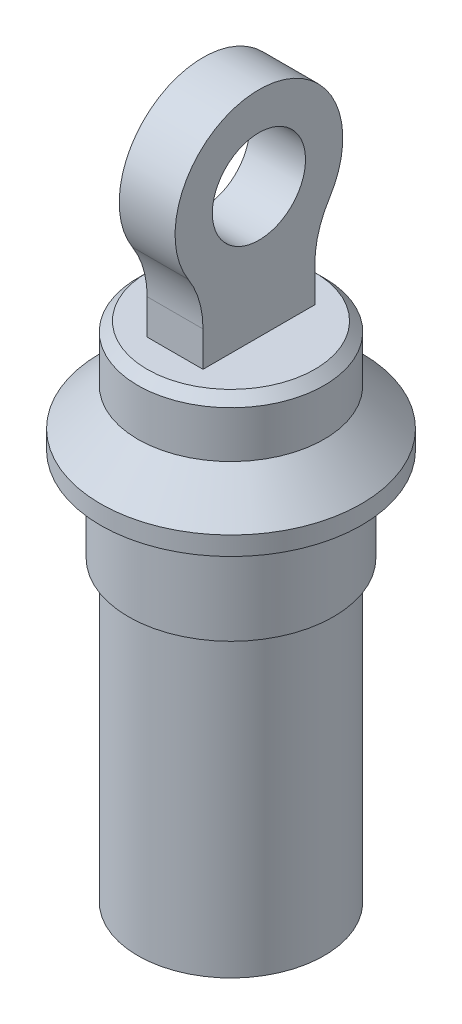
ISO-10303-21;
HEADER;
FILE_DESCRIPTION(('STEP AP214'),'2;1');
FILE_NAME('part.step','',(''),(''),'','','');
FILE_SCHEMA(('AUTOMOTIVE_DESIGN { 1 0 10303 214 1 1 1 1 }'));
ENDSEC;
DATA;
#1=APPLICATION_CONTEXT('core data for automotive mechanical design processes');
#2=APPLICATION_PROTOCOL_DEFINITION('international standard','automotive_design',2000,#1);
#3=PRODUCT_CONTEXT('',#1,'mechanical');
#4=PRODUCT('Part','Part','',(#3));
#5=PRODUCT_RELATED_PRODUCT_CATEGORY('part','',(#4));
#6=PRODUCT_DEFINITION_FORMATION('','',#4);
#7=PRODUCT_DEFINITION_CONTEXT('part definition',#1,'design');
#8=PRODUCT_DEFINITION('design','',#6,#7);
#9=PRODUCT_DEFINITION_SHAPE('','',#8);
#10=(LENGTH_UNIT() NAMED_UNIT(*) SI_UNIT(.MILLI.,.METRE.));
#11=(NAMED_UNIT(*) PLANE_ANGLE_UNIT() SI_UNIT($,.RADIAN.));
#12=(NAMED_UNIT(*) SI_UNIT($,.STERADIAN.) SOLID_ANGLE_UNIT());
#13=UNCERTAINTY_MEASURE_WITH_UNIT(LENGTH_MEASURE(1.E-05),#10,'distance_accuracy_value','');
#14=(GEOMETRIC_REPRESENTATION_CONTEXT(3) GLOBAL_UNCERTAINTY_ASSIGNED_CONTEXT((#13)) GLOBAL_UNIT_ASSIGNED_CONTEXT((#10,
#11,#12)) REPRESENTATION_CONTEXT('',''));
#15=CARTESIAN_POINT('',(0.,0.,0.));
#16=DIRECTION('',(0.,0.,1.));
#17=DIRECTION('',(1.,0.,0.));
#18=AXIS2_PLACEMENT_3D('',#15,#16,#17);
#19=CARTESIAN_POINT('',(0.,8.,0.));
#20=DIRECTION('',(0.,-1.,0.));
#21=DIRECTION('',(0.,0.,-1.));
#22=AXIS2_PLACEMENT_3D('',#19,#20,#21);
#23=CYLINDRICAL_SURFACE('',#22,5.);
#24=CARTESIAN_POINT('',(0.,8.,0.));
#25=DIRECTION('',(0.,1.,0.));
#26=DIRECTION('',(0.,0.,1.));
#27=AXIS2_PLACEMENT_3D('',#24,#25,#26);
#28=CIRCLE('',#27,5.);
#29=CARTESIAN_POINT('',(0.,8.,5.));
#30=VERTEX_POINT('',#29);
#31=EDGE_CURVE('E137',#30,#30,#28,.T.);
#32=ORIENTED_EDGE('',*,*,#31,.F.);
#33=EDGE_LOOP('',(#32));
#34=FACE_BOUND('',#33,.T.);
#35=CARTESIAN_POINT('',(0.,-8.,0.));
#36=DIRECTION('',(0.,-1.,0.));
#37=DIRECTION('',(0.,0.,-1.));
#38=AXIS2_PLACEMENT_3D('',#35,#36,#37);
#39=CIRCLE('',#38,5.);
#40=CARTESIAN_POINT('',(0.,-8.,-5.));
#41=VERTEX_POINT('',#40);
#42=EDGE_CURVE('E387',#41,#41,#39,.T.);
#43=ORIENTED_EDGE('',*,*,#42,.F.);
#44=EDGE_LOOP('',(#43));
#45=FACE_BOUND('',#44,.T.);
#46=ADVANCED_FACE('F40',(#34,#45),#23,.T.);
#47=CARTESIAN_POINT('',(0.,13.,0.));
#48=DIRECTION('',(0.,-1.,0.));
#49=DIRECTION('',(0.,0.,-1.));
#50=AXIS2_PLACEMENT_3D('',#47,#48,#49);
#51=CYLINDRICAL_SURFACE('',#50,5.5);
#52=CARTESIAN_POINT('',(0.,13.,0.));
#53=DIRECTION('',(0.,1.,0.));
#54=DIRECTION('',(0.,0.,1.));
#55=AXIS2_PLACEMENT_3D('',#52,#53,#54);
#56=CIRCLE('',#55,5.5);
#57=CARTESIAN_POINT('',(0.,13.,5.5));
#58=VERTEX_POINT('',#57);
#59=EDGE_CURVE('E134',#58,#58,#56,.T.);
#60=ORIENTED_EDGE('',*,*,#59,.F.);
#61=EDGE_LOOP('',(#60));
#62=FACE_BOUND('',#61,.T.);
#63=CARTESIAN_POINT('',(0.,8.,0.));
#64=DIRECTION('',(0.,1.,0.));
#65=DIRECTION('',(0.,0.,1.));
#66=AXIS2_PLACEMENT_3D('',#63,#64,#65);
#67=CIRCLE('',#66,5.5);
#68=CARTESIAN_POINT('',(0.,8.,5.5));
#69=VERTEX_POINT('',#68);
#70=EDGE_CURVE('E131',#69,#69,#67,.T.);
#71=ORIENTED_EDGE('',*,*,#70,.T.);
#72=EDGE_LOOP('',(#71));
#73=FACE_BOUND('',#72,.T.);
#74=ADVANCED_FACE('F178',(#62,#73),#51,.T.);
#75=CARTESIAN_POINT('',(0.,8.,0.));
#76=DIRECTION('',(0.,1.,0.));
#77=DIRECTION('',(0.,0.,1.));
#78=AXIS2_PLACEMENT_3D('',#75,#76,#77);
#79=PLANE('',#78);
#80=ORIENTED_EDGE('',*,*,#31,.T.);
#81=EDGE_LOOP('',(#80));
#82=FACE_BOUND('',#81,.T.);
#83=ORIENTED_EDGE('',*,*,#70,.F.);
#84=EDGE_LOOP('',(#83));
#85=FACE_BOUND('',#84,.T.);
#86=ADVANCED_FACE('F184',(#82,#85),#79,.F.);
#87=CARTESIAN_POINT('',(0.,14.,0.));
#88=DIRECTION('',(0.,-1.,0.));
#89=DIRECTION('',(0.,0.,-1.));
#90=AXIS2_PLACEMENT_3D('',#87,#88,#89);
#91=CYLINDRICAL_SURFACE('',#90,7.);
#92=CARTESIAN_POINT('',(0.,14.,0.));
#93=DIRECTION('',(0.,1.,0.));
#94=DIRECTION('',(0.,0.,1.));
#95=AXIS2_PLACEMENT_3D('',#92,#93,#94);
#96=CIRCLE('',#95,7.);
#97=CARTESIAN_POINT('',(0.,14.,7.));
#98=VERTEX_POINT('',#97);
#99=EDGE_CURVE('E128',#98,#98,#96,.T.);
#100=ORIENTED_EDGE('',*,*,#99,.F.);
#101=EDGE_LOOP('',(#100));
#102=FACE_BOUND('',#101,.T.);
#103=CARTESIAN_POINT('',(0.,13.,0.));
#104=DIRECTION('',(0.,1.,0.));
#105=DIRECTION('',(0.,0.,1.));
#106=AXIS2_PLACEMENT_3D('',#103,#104,#105);
#107=CIRCLE('',#106,7.);
#108=CARTESIAN_POINT('',(0.,13.,7.));
#109=VERTEX_POINT('',#108);
#110=EDGE_CURVE('E127',#109,#109,#107,.T.);
#111=ORIENTED_EDGE('',*,*,#110,.T.);
#112=EDGE_LOOP('',(#111));
#113=FACE_BOUND('',#112,.T.);
#114=ADVANCED_FACE('F215',(#102,#113),#91,.T.);
#115=CARTESIAN_POINT('',(0.,13.,0.));
#116=DIRECTION('',(0.,1.,0.));
#117=DIRECTION('',(0.,0.,1.));
#118=AXIS2_PLACEMENT_3D('',#115,#116,#117);
#119=PLANE('',#118);
#120=ORIENTED_EDGE('',*,*,#59,.T.);
#121=EDGE_LOOP('',(#120));
#122=FACE_BOUND('',#121,.T.);
#123=ORIENTED_EDGE('',*,*,#110,.F.);
#124=EDGE_LOOP('',(#123));
#125=FACE_BOUND('',#124,.T.);
#126=ADVANCED_FACE('F218',(#122,#125),#119,.F.);
#127=CARTESIAN_POINT('',(0.,19.,0.));
#128=DIRECTION('',(0.,1.,0.));
#129=DIRECTION('',(0.,0.,1.));
#130=AXIS2_PLACEMENT_3D('',#127,#128,#129);
#131=PLANE('',#130);
#132=DIRECTION('',(0.,0.,-1.));
#133=VECTOR('',#132,1.);
#134=CARTESIAN_POINT('',(1.49816734392516,19.,3.));
#135=LINE('',#134,#133);
#136=CARTESIAN_POINT('',(1.49816734392516,19.,3.));
#137=VERTEX_POINT('',#136);
#138=CARTESIAN_POINT('',(1.49816734392516,19.,-3.));
#139=VERTEX_POINT('',#138);
#140=EDGE_CURVE('E113',#137,#139,#135,.T.);
#141=ORIENTED_EDGE('',*,*,#140,.F.);
#142=DIRECTION('',(1.,0.,0.));
#143=VECTOR('',#142,1.);
#144=CARTESIAN_POINT('',(-1.49816734392516,19.,3.));
#145=LINE('',#144,#143);
#146=CARTESIAN_POINT('',(-1.49816734392516,19.,3.));
#147=VERTEX_POINT('',#146);
#148=EDGE_CURVE('E109',#147,#137,#145,.T.);
#149=ORIENTED_EDGE('',*,*,#148,.F.);
#150=DIRECTION('',(0.,0.,1.));
#151=VECTOR('',#150,1.);
#152=CARTESIAN_POINT('',(-1.49816734392516,19.,3.));
#153=LINE('',#152,#151);
#154=CARTESIAN_POINT('',(-1.49816734392516,19.,-3.));
#155=VERTEX_POINT('',#154);
#156=EDGE_CURVE('E94',#155,#147,#153,.T.);
#157=ORIENTED_EDGE('',*,*,#156,.F.);
#158=DIRECTION('',(-1.,0.,0.));
#159=VECTOR('',#158,1.);
#160=CARTESIAN_POINT('',(-1.49816734392516,19.,-3.));
#161=LINE('',#160,#159);
#162=EDGE_CURVE('E106',#139,#155,#161,.T.);
#163=ORIENTED_EDGE('',*,*,#162,.F.);
#164=EDGE_LOOP('',(#141,#149,#157,#163));
#165=FACE_BOUND('',#164,.T.);
#166=CARTESIAN_POINT('',(0.,19.,0.));
#167=DIRECTION('',(0.,1.,0.));
#168=DIRECTION('',(0.,0.,1.));
#169=AXIS2_PLACEMENT_3D('',#166,#167,#168);
#170=CIRCLE('',#169,4.49999999999999);
#171=CARTESIAN_POINT('',(0.,19.,4.49999999999999));
#172=VERTEX_POINT('',#171);
#173=EDGE_CURVE('E145',#172,#172,#170,.T.);
#174=ORIENTED_EDGE('',*,*,#173,.T.);
#175=EDGE_LOOP('',(#174));
#176=FACE_BOUND('',#175,.T.);
#177=ADVANCED_FACE('F104',(#165,#176),#131,.T.);
#178=CARTESIAN_POINT('',(0.,14.,0.));
#179=DIRECTION('',(0.,-1.,0.));
#180=DIRECTION('',(0.,0.,-1.));
#181=AXIS2_PLACEMENT_3D('',#178,#179,#180);
#182=CYLINDRICAL_SURFACE('',#181,5.);
#183=CARTESIAN_POINT('',(0.,18.5,0.));
#184=DIRECTION('',(0.,1.,0.));
#185=DIRECTION('',(0.,0.,1.));
#186=AXIS2_PLACEMENT_3D('',#183,#184,#185);
#187=CIRCLE('',#186,5.);
#188=CARTESIAN_POINT('',(0.,18.5,5.));
#189=VERTEX_POINT('',#188);
#190=EDGE_CURVE('E142',#189,#189,#187,.F.);
#191=ORIENTED_EDGE('',*,*,#190,.T.);
#192=EDGE_LOOP('',(#191));
#193=FACE_BOUND('',#192,.T.);
#194=CARTESIAN_POINT('',(0.,16.,0.));
#195=DIRECTION('',(0.,-1.,0.));
#196=DIRECTION('',(0.,0.,-1.));
#197=AXIS2_PLACEMENT_3D('',#194,#195,#196);
#198=CIRCLE('',#197,5.);
#199=CARTESIAN_POINT('',(0.,16.,-5.));
#200=VERTEX_POINT('',#199);
#201=EDGE_CURVE('E124',#200,#200,#198,.T.);
#202=ORIENTED_EDGE('',*,*,#201,.F.);
#203=EDGE_LOOP('',(#202));
#204=FACE_BOUND('',#203,.T.);
#205=ADVANCED_FACE('F201',(#193,#204),#182,.T.);
#206=CARTESIAN_POINT('',(0.,14.,0.));
#207=DIRECTION('',(0.,-1.,0.));
#208=DIRECTION('',(0.,0.,-1.));
#209=AXIS2_PLACEMENT_3D('',#206,#207,#208);
#210=CONICAL_SURFACE('',#209,7.,0.785398163397447);
#211=ORIENTED_EDGE('',*,*,#201,.T.);
#212=EDGE_LOOP('',(#211));
#213=FACE_BOUND('',#212,.T.);
#214=ORIENTED_EDGE('',*,*,#99,.T.);
#215=EDGE_LOOP('',(#214));
#216=FACE_BOUND('',#215,.T.);
#217=ADVANCED_FACE('F193',(#213,#216),#210,.T.);
#218=CARTESIAN_POINT('',(0.,18.5,0.));
#219=DIRECTION('',(0.,-1.,0.));
#220=DIRECTION('',(0.,0.,-1.));
#221=AXIS2_PLACEMENT_3D('',#218,#219,#220);
#222=CONICAL_SURFACE('',#221,5.,0.785398163397454);
#223=ORIENTED_EDGE('',*,*,#173,.F.);
#224=EDGE_LOOP('',(#223));
#225=FACE_BOUND('',#224,.T.);
#226=ORIENTED_EDGE('',*,*,#190,.F.);
#227=EDGE_LOOP('',(#226));
#228=FACE_BOUND('',#227,.T.);
#229=ADVANCED_FACE('F191',(#225,#228),#222,.T.);
#230=CARTESIAN_POINT('',(1.49816734392516,26.,3.));
#231=DIRECTION('',(-1.,0.,0.));
#232=DIRECTION('',(0.,0.,1.));
#233=AXIS2_PLACEMENT_3D('',#230,#231,#232);
#234=PLANE('',#233);
#235=CARTESIAN_POINT('',(1.49816734392516,26.,0.));
#236=DIRECTION('',(-1.,0.,0.));
#237=DIRECTION('',(0.,0.,1.));
#238=AXIS2_PLACEMENT_3D('',#235,#236,#237);
#239=CIRCLE('',#238,2.5);
#240=CARTESIAN_POINT('',(1.49816734392516,26.,2.5));
#241=VERTEX_POINT('',#240);
#242=EDGE_CURVE('E379',#241,#241,#239,.T.);
#243=ORIENTED_EDGE('',*,*,#242,.T.);
#244=EDGE_LOOP('',(#243));
#245=FACE_BOUND('',#244,.T.);
#246=DIRECTION('',(0.,-1.,0.));
#247=VECTOR('',#246,1.);
#248=CARTESIAN_POINT('',(1.49816734392516,26.,-3.));
#249=LINE('',#248,#247);
#250=CARTESIAN_POINT('',(1.49816734392516,20.8765246170202,-3.));
#251=VERTEX_POINT('',#250);
#252=EDGE_CURVE('E97',#251,#139,#249,.T.);
#253=ORIENTED_EDGE('',*,*,#252,.F.);
#254=CARTESIAN_POINT('',(1.49816734392516,20.8765246170202,-8.));
#255=DIRECTION('',(-1.,0.,0.));
#256=DIRECTION('',(0.,0.,1.));
#257=AXIS2_PLACEMENT_3D('',#254,#255,#256);
#258=CIRCLE('',#257,5.);
#259=CARTESIAN_POINT('',(1.49816734392516,23.5730906080622,-3.78947368421053));
#260=VERTEX_POINT('',#259);
#261=EDGE_CURVE('E48',#251,#260,#258,.T.);
#262=ORIENTED_EDGE('',*,*,#261,.T.);
#263=CARTESIAN_POINT('',(1.49816734392516,26.,0.));
#264=DIRECTION('',(1.,0.,0.));
#265=DIRECTION('',(0.,0.,-1.));
#266=AXIS2_PLACEMENT_3D('',#263,#264,#265);
#267=CIRCLE('',#266,4.5);
#268=CARTESIAN_POINT('',(1.49816734392516,23.5730906080622,3.78947368421053));
#269=VERTEX_POINT('',#268);
#270=EDGE_CURVE('E115',#260,#269,#267,.T.);
#271=ORIENTED_EDGE('',*,*,#270,.T.);
#272=CARTESIAN_POINT('',(1.49816734392516,20.8765246170202,8.));
#273=DIRECTION('',(-1.,0.,0.));
#274=DIRECTION('',(0.,0.,1.));
#275=AXIS2_PLACEMENT_3D('',#272,#273,#274);
#276=CIRCLE('',#275,5.);
#277=CARTESIAN_POINT('',(1.49816734392516,20.8765246170202,3.));
#278=VERTEX_POINT('',#277);
#279=EDGE_CURVE('E159',#269,#278,#276,.T.);
#280=ORIENTED_EDGE('',*,*,#279,.T.);
#281=DIRECTION('',(0.,-1.,0.));
#282=VECTOR('',#281,1.);
#283=CARTESIAN_POINT('',(1.49816734392516,26.,3.));
#284=LINE('',#283,#282);
#285=EDGE_CURVE('E120',#278,#137,#284,.T.);
#286=ORIENTED_EDGE('',*,*,#285,.T.);
#287=ORIENTED_EDGE('',*,*,#140,.T.);
#288=EDGE_LOOP('',(#253,#262,#271,#280,#286,#287));
#289=FACE_BOUND('',#288,.T.);
#290=ADVANCED_FACE('F163',(#245,#289),#234,.F.);
#291=CARTESIAN_POINT('',(-1.49816734392516,26.,-3.));
#292=DIRECTION('',(0.,0.,1.));
#293=DIRECTION('',(1.,0.,0.));
#294=AXIS2_PLACEMENT_3D('',#291,#292,#293);
#295=PLANE('',#294);
#296=DIRECTION('',(0.,-1.,0.));
#297=VECTOR('',#296,1.);
#298=CARTESIAN_POINT('',(-1.49816734392516,26.,-3.));
#299=LINE('',#298,#297);
#300=CARTESIAN_POINT('',(-1.49816734392516,20.8765246170202,-3.));
#301=VERTEX_POINT('',#300);
#302=EDGE_CURVE('E90',#301,#155,#299,.T.);
#303=ORIENTED_EDGE('',*,*,#302,.F.);
#304=DIRECTION('',(1.,0.,0.));
#305=VECTOR('',#304,1.);
#306=CARTESIAN_POINT('',(-1.49816734392516,20.8765246170202,-3.));
#307=LINE('',#306,#305);
#308=EDGE_CURVE('E155',#301,#251,#307,.T.);
#309=ORIENTED_EDGE('',*,*,#308,.T.);
#310=ORIENTED_EDGE('',*,*,#252,.T.);
#311=ORIENTED_EDGE('',*,*,#162,.T.);
#312=EDGE_LOOP('',(#303,#309,#310,#311));
#313=FACE_BOUND('',#312,.T.);
#314=ADVANCED_FACE('F111',(#313),#295,.F.);
#315=CARTESIAN_POINT('',(-1.49816734392516,26.,3.));
#316=DIRECTION('',(1.,0.,0.));
#317=DIRECTION('',(0.,0.,-1.));
#318=AXIS2_PLACEMENT_3D('',#315,#316,#317);
#319=PLANE('',#318);
#320=CARTESIAN_POINT('',(-1.49816734392516,26.,0.));
#321=DIRECTION('',(-1.,0.,0.));
#322=DIRECTION('',(0.,0.,1.));
#323=AXIS2_PLACEMENT_3D('',#320,#321,#322);
#324=CIRCLE('',#323,2.5);
#325=CARTESIAN_POINT('',(-1.49816734392516,26.,2.5));
#326=VERTEX_POINT('',#325);
#327=EDGE_CURVE('E382',#326,#326,#324,.T.);
#328=ORIENTED_EDGE('',*,*,#327,.F.);
#329=EDGE_LOOP('',(#328));
#330=FACE_BOUND('',#329,.T.);
#331=DIRECTION('',(0.,-1.,0.));
#332=VECTOR('',#331,1.);
#333=CARTESIAN_POINT('',(-1.49816734392516,26.,3.));
#334=LINE('',#333,#332);
#335=CARTESIAN_POINT('',(-1.49816734392516,20.8765246170202,3.));
#336=VERTEX_POINT('',#335);
#337=EDGE_CURVE('E98',#336,#147,#334,.T.);
#338=ORIENTED_EDGE('',*,*,#337,.F.);
#339=CARTESIAN_POINT('',(-1.49816734392516,20.8765246170202,8.));
#340=DIRECTION('',(1.,0.,0.));
#341=DIRECTION('',(0.,0.,-1.));
#342=AXIS2_PLACEMENT_3D('',#339,#340,#341);
#343=CIRCLE('',#342,5.);
#344=CARTESIAN_POINT('',(-1.49816734392516,23.5730906080622,3.78947368421052));
#345=VERTEX_POINT('',#344);
#346=EDGE_CURVE('E157',#336,#345,#343,.T.);
#347=ORIENTED_EDGE('',*,*,#346,.T.);
#348=CARTESIAN_POINT('',(-1.49816734392516,26.,0.));
#349=DIRECTION('',(-1.,0.,0.));
#350=DIRECTION('',(0.,0.,1.));
#351=AXIS2_PLACEMENT_3D('',#348,#349,#350);
#352=CIRCLE('',#351,4.5);
#353=CARTESIAN_POINT('',(-1.49816734392516,23.5730906080622,-3.78947368421053));
#354=VERTEX_POINT('',#353);
#355=EDGE_CURVE('E169',#345,#354,#352,.T.);
#356=ORIENTED_EDGE('',*,*,#355,.T.);
#357=CARTESIAN_POINT('',(-1.49816734392516,20.8765246170202,-8.));
#358=DIRECTION('',(1.,0.,0.));
#359=DIRECTION('',(0.,0.,-1.));
#360=AXIS2_PLACEMENT_3D('',#357,#358,#359);
#361=CIRCLE('',#360,5.);
#362=EDGE_CURVE('E11',#354,#301,#361,.T.);
#363=ORIENTED_EDGE('',*,*,#362,.T.);
#364=ORIENTED_EDGE('',*,*,#302,.T.);
#365=ORIENTED_EDGE('',*,*,#156,.T.);
#366=EDGE_LOOP('',(#338,#347,#356,#363,#364,#365));
#367=FACE_BOUND('',#366,.T.);
#368=ADVANCED_FACE('F93',(#330,#367),#319,.F.);
#369=CARTESIAN_POINT('',(-1.49816734392516,26.,3.));
#370=DIRECTION('',(0.,0.,-1.));
#371=DIRECTION('',(-1.,0.,0.));
#372=AXIS2_PLACEMENT_3D('',#369,#370,#371);
#373=PLANE('',#372);
#374=ORIENTED_EDGE('',*,*,#285,.F.);
#375=DIRECTION('',(1.,0.,0.));
#376=VECTOR('',#375,1.);
#377=CARTESIAN_POINT('',(-1.49816734392516,20.8765246170202,3.));
#378=LINE('',#377,#376);
#379=EDGE_CURVE('E148',#278,#336,#378,.F.);
#380=ORIENTED_EDGE('',*,*,#379,.T.);
#381=ORIENTED_EDGE('',*,*,#337,.T.);
#382=ORIENTED_EDGE('',*,*,#148,.T.);
#383=EDGE_LOOP('',(#374,#380,#381,#382));
#384=FACE_BOUND('',#383,.T.);
#385=ADVANCED_FACE('F345',(#384),#373,.F.);
#386=CARTESIAN_POINT('',(-1.49183265607484,26.,0.));
#387=DIRECTION('',(1.,0.,0.));
#388=DIRECTION('',(0.,0.,-1.));
#389=AXIS2_PLACEMENT_3D('',#386,#387,#388);
#390=CYLINDRICAL_SURFACE('',#389,4.5);
#391=ORIENTED_EDGE('',*,*,#355,.F.);
#392=DIRECTION('',(1.,0.,0.));
#393=VECTOR('',#392,1.);
#394=CARTESIAN_POINT('',(-1.49183265607484,23.5730906080622,3.78947368421053));
#395=LINE('',#394,#393);
#396=EDGE_CURVE('E153',#345,#269,#395,.T.);
#397=ORIENTED_EDGE('',*,*,#396,.T.);
#398=ORIENTED_EDGE('',*,*,#270,.F.);
#399=DIRECTION('',(1.,0.,0.));
#400=VECTOR('',#399,1.);
#401=CARTESIAN_POINT('',(-1.49183265607484,23.5730906080622,-3.78947368421053));
#402=LINE('',#401,#400);
#403=EDGE_CURVE('E151',#260,#354,#402,.F.);
#404=ORIENTED_EDGE('',*,*,#403,.T.);
#405=EDGE_LOOP('',(#391,#397,#398,#404));
#406=FACE_BOUND('',#405,.T.);
#407=ADVANCED_FACE('F167',(#406),#390,.T.);
#408=CARTESIAN_POINT('',(2.50183265607484,26.,0.));
#409=DIRECTION('',(-1.,0.,0.));
#410=DIRECTION('',(0.,0.,1.));
#411=AXIS2_PLACEMENT_3D('',#408,#409,#410);
#412=CYLINDRICAL_SURFACE('',#411,2.5);
#413=ORIENTED_EDGE('',*,*,#327,.T.);
#414=EDGE_LOOP('',(#413));
#415=FACE_BOUND('',#414,.T.);
#416=ORIENTED_EDGE('',*,*,#242,.F.);
#417=EDGE_LOOP('',(#416));
#418=FACE_BOUND('',#417,.T.);
#419=ADVANCED_FACE('F274',(#415,#418),#412,.F.);
#420=CARTESIAN_POINT('',(0.,-8.,0.));
#421=DIRECTION('',(0.,-1.,0.));
#422=DIRECTION('',(0.,0.,-1.));
#423=AXIS2_PLACEMENT_3D('',#420,#421,#422);
#424=PLANE('',#423);
#425=CARTESIAN_POINT('',(0.,-8.,0.));
#426=DIRECTION('',(0.,-1.,0.));
#427=DIRECTION('',(0.,0.,-1.));
#428=AXIS2_PLACEMENT_3D('',#425,#426,#427);
#429=CIRCLE('',#428,3.5);
#430=CARTESIAN_POINT('',(0.,-8.,-3.5));
#431=VERTEX_POINT('',#430);
#432=EDGE_CURVE('E391',#431,#431,#429,.T.);
#433=ORIENTED_EDGE('',*,*,#432,.F.);
#434=EDGE_LOOP('',(#433));
#435=FACE_BOUND('',#434,.T.);
#436=ORIENTED_EDGE('',*,*,#42,.T.);
#437=EDGE_LOOP('',(#436));
#438=FACE_BOUND('',#437,.T.);
#439=ADVANCED_FACE('F278',(#435,#438),#424,.T.);
#440=CARTESIAN_POINT('',(0.,18.,0.));
#441=DIRECTION('',(0.,-1.,0.));
#442=DIRECTION('',(0.,0.,-1.));
#443=AXIS2_PLACEMENT_3D('',#440,#441,#442);
#444=CYLINDRICAL_SURFACE('',#443,3.5);
#445=CARTESIAN_POINT('',(0.,18.,0.));
#446=DIRECTION('',(0.,-1.,0.));
#447=DIRECTION('',(0.,0.,-1.));
#448=AXIS2_PLACEMENT_3D('',#445,#446,#447);
#449=CIRCLE('',#448,3.5);
#450=CARTESIAN_POINT('',(0.,18.,-3.5));
#451=VERTEX_POINT('',#450);
#452=EDGE_CURVE('E390',#451,#451,#449,.T.);
#453=CARTESIAN_POINT('',(0.,18.,-3.5));
#454=CARTESIAN_POINT('',(0.,17.7291666666667,-3.5));
#455=CARTESIAN_POINT('',(0.,17.4583333333333,-3.5));
#456=CARTESIAN_POINT('',(0.,16.9166666666667,-3.5));
#457=CARTESIAN_POINT('',(0.,16.6458333333333,-3.5));
#458=CARTESIAN_POINT('',(0.,16.1041666666667,-3.5));
#459=CARTESIAN_POINT('',(0.,15.8333333333333,-3.5));
#460=CARTESIAN_POINT('',(0.,15.2916666666667,-3.5));
#461=CARTESIAN_POINT('',(0.,15.0208333333333,-3.5));
#462=CARTESIAN_POINT('',(0.,14.4791666666667,-3.5));
#463=CARTESIAN_POINT('',(0.,14.2083333333333,-3.5));
#464=CARTESIAN_POINT('',(0.,13.6666666666667,-3.5));
#465=CARTESIAN_POINT('',(0.,13.3958333333333,-3.5));
#466=CARTESIAN_POINT('',(0.,12.8541666666667,-3.5));
#467=CARTESIAN_POINT('',(0.,12.5833333333333,-3.5));
#468=CARTESIAN_POINT('',(0.,12.0416666666667,-3.5));
#469=CARTESIAN_POINT('',(0.,11.7708333333333,-3.5));
#470=CARTESIAN_POINT('',(0.,11.2291666666667,-3.5));
#471=CARTESIAN_POINT('',(0.,10.9583333333333,-3.5));
#472=CARTESIAN_POINT('',(0.,10.4166666666667,-3.5));
#473=CARTESIAN_POINT('',(0.,10.1458333333333,-3.5));
#474=CARTESIAN_POINT('',(0.,9.60416666666667,-3.5));
#475=CARTESIAN_POINT('',(0.,9.33333333333333,-3.5));
#476=CARTESIAN_POINT('',(0.,8.79166666666667,-3.5));
#477=CARTESIAN_POINT('',(0.,8.52083333333333,-3.5));
#478=CARTESIAN_POINT('',(0.,7.97916666666667,-3.5));
#479=CARTESIAN_POINT('',(0.,7.70833333333333,-3.5));
#480=CARTESIAN_POINT('',(0.,7.16666666666667,-3.5));
#481=CARTESIAN_POINT('',(0.,6.89583333333333,-3.5));
#482=CARTESIAN_POINT('',(0.,6.35416666666667,-3.5));
#483=CARTESIAN_POINT('',(0.,6.08333333333333,-3.5));
#484=CARTESIAN_POINT('',(0.,5.54166666666667,-3.5));
#485=CARTESIAN_POINT('',(0.,5.27083333333333,-3.5));
#486=CARTESIAN_POINT('',(0.,4.72916666666667,-3.5));
#487=CARTESIAN_POINT('',(0.,4.45833333333333,-3.5));
#488=CARTESIAN_POINT('',(0.,3.91666666666667,-3.5));
#489=CARTESIAN_POINT('',(0.,3.64583333333333,-3.5));
#490=CARTESIAN_POINT('',(0.,3.10416666666667,-3.5));
#491=CARTESIAN_POINT('',(0.,2.83333333333333,-3.5));
#492=CARTESIAN_POINT('',(0.,2.29166666666667,-3.5));
#493=CARTESIAN_POINT('',(0.,2.02083333333333,-3.5));
#494=CARTESIAN_POINT('',(0.,1.47916666666667,-3.5));
#495=CARTESIAN_POINT('',(0.,1.20833333333333,-3.5));
#496=CARTESIAN_POINT('',(0.,0.666666666666667,-3.5));
#497=CARTESIAN_POINT('',(0.,0.395833333333334,-3.5));
#498=CARTESIAN_POINT('',(0.,-0.145833333333333,-3.5));
#499=CARTESIAN_POINT('',(0.,-0.416666666666667,-3.5));
#500=CARTESIAN_POINT('',(0.,-0.958333333333334,-3.5));
#501=CARTESIAN_POINT('',(0.,-1.22916666666667,-3.5));
#502=CARTESIAN_POINT('',(0.,-1.77083333333333,-3.5));
#503=CARTESIAN_POINT('',(0.,-2.04166666666667,-3.5));
#504=CARTESIAN_POINT('',(0.,-2.58333333333333,-3.5));
#505=CARTESIAN_POINT('',(0.,-2.85416666666667,-3.5));
#506=CARTESIAN_POINT('',(0.,-3.39583333333333,-3.5));
#507=CARTESIAN_POINT('',(0.,-3.66666666666667,-3.5));
#508=CARTESIAN_POINT('',(0.,-4.20833333333333,-3.5));
#509=CARTESIAN_POINT('',(0.,-4.47916666666667,-3.5));
#510=CARTESIAN_POINT('',(0.,-5.02083333333333,-3.5));
#511=CARTESIAN_POINT('',(0.,-5.29166666666667,-3.5));
#512=CARTESIAN_POINT('',(0.,-5.83333333333333,-3.5));
#513=CARTESIAN_POINT('',(0.,-6.10416666666667,-3.5));
#514=CARTESIAN_POINT('',(0.,-6.64583333333333,-3.5));
#515=CARTESIAN_POINT('',(0.,-6.91666666666667,-3.5));
#516=CARTESIAN_POINT('',(0.,-7.45833333333333,-3.5));
#517=CARTESIAN_POINT('',(0.,-7.72916666666667,-3.5));
#518=CARTESIAN_POINT('',(0.,-8.,-3.5));
#519=B_SPLINE_CURVE_WITH_KNOTS('',3,(#453,#454,#455,#456,#457,#458,#459,#460,#461,#462,#463,
#464,#465,#466,#467,#468,#469,#470,#471,#472,#473,#474,#475,#476,#477,#478,#479,#480,#481,#482,
#483,#484,#485,#486,#487,#488,#489,#490,#491,#492,#493,#494,#495,#496,#497,#498,#499,#500,#501,
#502,#503,#504,#505,#506,#507,#508,#509,#510,#511,#512,#513,#514,#515,#516,#517,#518),
.UNSPECIFIED.,.F.,.F.,(4,2,2,2,2,2,2,2,2,2,2,2,2,2,2,2,2,2,2,2,2,2,2,2,2,2,2,2,2,2,2,2,4),(0.,
0.812499999999997,1.625,2.4375,3.25,4.0625,4.875,5.6875,6.5,7.3125,8.125,8.9375,9.75,10.5625,
11.375,12.1875,13.,13.8125,14.625,15.4375,16.25,17.0625,17.875,18.6875,19.5,20.3125,21.125,
21.9375,22.75,23.5625,24.375,25.1875,26.),.UNSPECIFIED.);
#520=EDGE_CURVE('BSEAM297',#451,#431,#519,.T.);
#521=ORIENTED_EDGE('',*,*,#452,.F.);
#522=ORIENTED_EDGE('',*,*,#432,.T.);
#523=ORIENTED_EDGE('',*,*,#520,.T.);
#524=ORIENTED_EDGE('',*,*,#520,.F.);
#525=EDGE_LOOP('',(#521,#523,#522,#524));
#526=FACE_BOUND('',#525,.T.);
#527=ADVANCED_FACE('F297',(#526),#444,.F.);
#528=CARTESIAN_POINT('',(0.,18.,0.));
#529=DIRECTION('',(0.,-1.,0.));
#530=DIRECTION('',(0.,0.,-1.));
#531=AXIS2_PLACEMENT_3D('',#528,#529,#530);
#532=PLANE('',#531);
#533=ORIENTED_EDGE('',*,*,#452,.T.);
#534=EDGE_LOOP('',(#533));
#535=FACE_BOUND('',#534,.T.);
#536=ADVANCED_FACE('F175',(#535),#532,.T.);
#537=CARTESIAN_POINT('',(-1.49183265607484,20.8765246170202,8.));
#538=DIRECTION('',(1.,0.,0.));
#539=DIRECTION('',(0.,0.,-1.));
#540=AXIS2_PLACEMENT_3D('',#537,#538,#539);
#541=CYLINDRICAL_SURFACE('',#540,5.);
#542=ORIENTED_EDGE('',*,*,#279,.F.);
#543=ORIENTED_EDGE('',*,*,#396,.F.);
#544=ORIENTED_EDGE('',*,*,#346,.F.);
#545=ORIENTED_EDGE('',*,*,#379,.F.);
#546=EDGE_LOOP('',(#542,#543,#544,#545));
#547=FACE_BOUND('',#546,.T.);
#548=ADVANCED_FACE('F171',(#547),#541,.F.);
#549=CARTESIAN_POINT('',(-1.49183265607484,20.8765246170202,-8.));
#550=DIRECTION('',(1.,0.,0.));
#551=DIRECTION('',(0.,0.,-1.));
#552=AXIS2_PLACEMENT_3D('',#549,#550,#551);
#553=CYLINDRICAL_SURFACE('',#552,5.);
#554=ORIENTED_EDGE('',*,*,#362,.F.);
#555=ORIENTED_EDGE('',*,*,#403,.F.);
#556=ORIENTED_EDGE('',*,*,#261,.F.);
#557=ORIENTED_EDGE('',*,*,#308,.F.);
#558=EDGE_LOOP('',(#554,#555,#556,#557));
#559=FACE_BOUND('',#558,.T.);
#560=ADVANCED_FACE('F42',(#559),#553,.F.);
#561=CLOSED_SHELL('',(#46,#74,#86,#114,#126,#177,#205,#217,#229,#290,#314,#368,#385,#407,#419,
#439,#527,#536,#548,#560));
#562=MANIFOLD_SOLID_BREP('B2',#561);
#563=ADVANCED_BREP_SHAPE_REPRESENTATION('',(#18,#562),#14);
#564=SHAPE_DEFINITION_REPRESENTATION(#9,#563);
ENDSEC;
END-ISO-10303-21;
